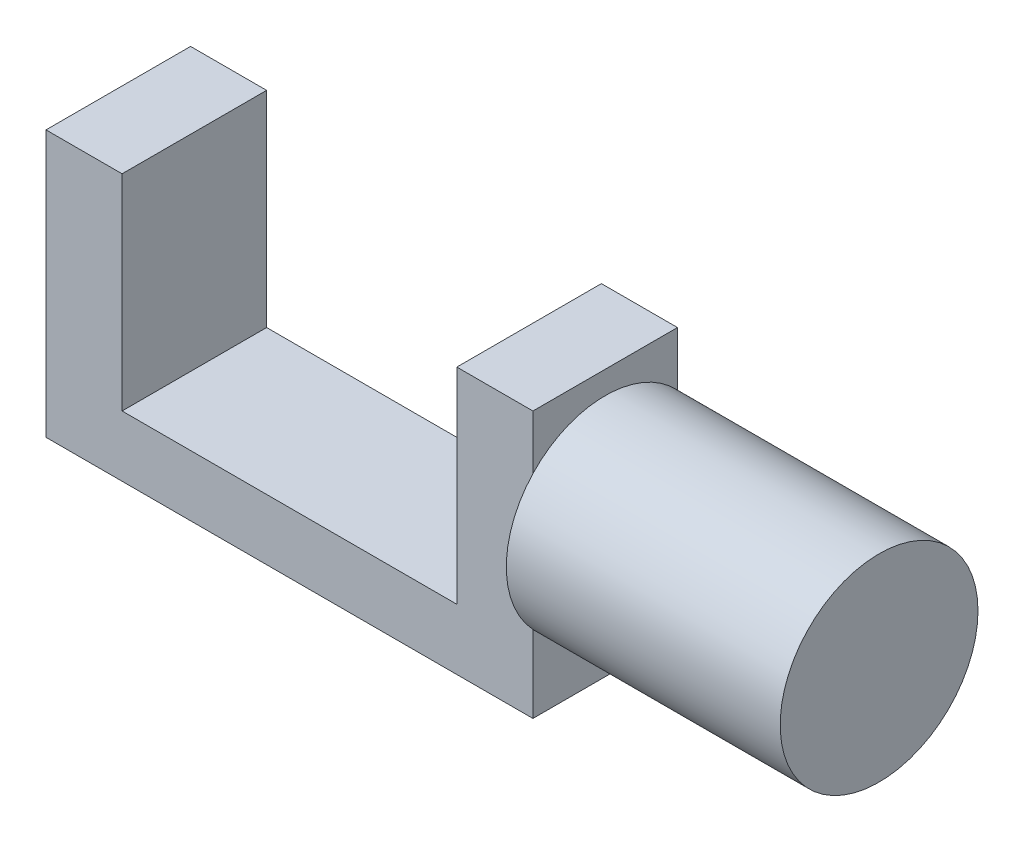
ISO-10303-21;
HEADER;
FILE_DESCRIPTION(('STEP AP214'),'2;1');
FILE_NAME('part.step','',(''),(''),'','','');
FILE_SCHEMA(('AUTOMOTIVE_DESIGN { 1 0 10303 214 1 1 1 1 }'));
ENDSEC;
DATA;
#1=APPLICATION_CONTEXT('core data for automotive mechanical design processes');
#2=APPLICATION_PROTOCOL_DEFINITION('international standard','automotive_design',2000,#1);
#3=PRODUCT_CONTEXT('',#1,'mechanical');
#4=PRODUCT('Part','Part','',(#3));
#5=PRODUCT_RELATED_PRODUCT_CATEGORY('part','',(#4));
#6=PRODUCT_DEFINITION_FORMATION('','',#4);
#7=PRODUCT_DEFINITION_CONTEXT('part definition',#1,'design');
#8=PRODUCT_DEFINITION('design','',#6,#7);
#9=PRODUCT_DEFINITION_SHAPE('','',#8);
#10=(LENGTH_UNIT() NAMED_UNIT(*) SI_UNIT(.MILLI.,.METRE.));
#11=(NAMED_UNIT(*) PLANE_ANGLE_UNIT() SI_UNIT($,.RADIAN.));
#12=(NAMED_UNIT(*) SI_UNIT($,.STERADIAN.) SOLID_ANGLE_UNIT());
#13=UNCERTAINTY_MEASURE_WITH_UNIT(LENGTH_MEASURE(1.E-05),#10,'distance_accuracy_value','');
#14=(GEOMETRIC_REPRESENTATION_CONTEXT(3) GLOBAL_UNCERTAINTY_ASSIGNED_CONTEXT((#13)) GLOBAL_UNIT_ASSIGNED_CONTEXT((#10,
#11,#12)) REPRESENTATION_CONTEXT('',''));
#15=CARTESIAN_POINT('',(0.,0.,0.));
#16=DIRECTION('',(0.,0.,1.));
#17=DIRECTION('',(1.,0.,0.));
#18=AXIS2_PLACEMENT_3D('',#15,#16,#17);
#19=CARTESIAN_POINT('',(32.,4.,0.));
#20=DIRECTION('',(-1.,0.,0.));
#21=DIRECTION('',(0.,0.,1.));
#22=AXIS2_PLACEMENT_3D('',#19,#20,#21);
#23=PLANE('',#22);
#24=CARTESIAN_POINT('',(32.,9.5,4.75));
#25=DIRECTION('',(1.,0.,0.));
#26=DIRECTION('',(0.,0.,-1.));
#27=AXIS2_PLACEMENT_3D('',#24,#25,#26);
#28=CIRCLE('',#27,6.5);
#29=CARTESIAN_POINT('',(32.,13.9370598373247,0.));
#30=VERTEX_POINT('',#29);
#31=CARTESIAN_POINT('',(32.,13.9370598373247,9.5));
#32=VERTEX_POINT('',#31);
#33=EDGE_CURVE('E45',#30,#32,#28,.T.);
#34=ORIENTED_EDGE('',*,*,#33,.F.);
#35=DIRECTION('',(0.,-1.,0.));
#36=VECTOR('',#35,1.);
#37=CARTESIAN_POINT('',(32.,4.,0.));
#38=LINE('',#37,#36);
#39=CARTESIAN_POINT('',(32.,17.5,0.));
#40=VERTEX_POINT('',#39);
#41=EDGE_CURVE('E119',#40,#30,#38,.T.);
#42=ORIENTED_EDGE('',*,*,#41,.F.);
#43=DIRECTION('',(0.,0.,-1.));
#44=VECTOR('',#43,1.);
#45=CARTESIAN_POINT('',(32.,17.5,0.));
#46=LINE('',#45,#44);
#47=CARTESIAN_POINT('',(32.,17.5,9.5));
#48=VERTEX_POINT('',#47);
#49=EDGE_CURVE('E140',#48,#40,#46,.T.);
#50=ORIENTED_EDGE('',*,*,#49,.F.);
#51=DIRECTION('',(0.,-1.,0.));
#52=VECTOR('',#51,1.);
#53=CARTESIAN_POINT('',(32.,4.,9.5));
#54=LINE('',#53,#52);
#55=EDGE_CURVE('E193',#48,#32,#54,.T.);
#56=ORIENTED_EDGE('',*,*,#55,.T.);
#57=EDGE_LOOP('',(#34,#42,#50,#56));
#58=FACE_BOUND('',#57,.T.);
#59=ADVANCED_FACE('F35',(#58),#23,.F.);
#60=CARTESIAN_POINT('',(0.,4.,0.));
#61=DIRECTION('',(0.,1.,0.));
#62=DIRECTION('',(0.,0.,1.));
#63=AXIS2_PLACEMENT_3D('',#60,#61,#62);
#64=PLANE('',#63);
#65=DIRECTION('',(1.,0.,0.));
#66=VECTOR('',#65,1.);
#67=CARTESIAN_POINT('',(0.,4.,9.5));
#68=LINE('',#67,#66);
#69=CARTESIAN_POINT('',(5.,4.,9.5));
#70=VERTEX_POINT('',#69);
#71=CARTESIAN_POINT('',(27.,4.,9.5));
#72=VERTEX_POINT('',#71);
#73=EDGE_CURVE('E179',#70,#72,#68,.T.);
#74=ORIENTED_EDGE('',*,*,#73,.T.);
#75=DIRECTION('',(0.,0.,1.));
#76=VECTOR('',#75,1.);
#77=CARTESIAN_POINT('',(27.,4.,0.));
#78=LINE('',#77,#76);
#79=CARTESIAN_POINT('',(27.,4.,0.));
#80=VERTEX_POINT('',#79);
#81=EDGE_CURVE('E144',#80,#72,#78,.T.);
#82=ORIENTED_EDGE('',*,*,#81,.F.);
#83=DIRECTION('',(-1.,0.,0.));
#84=VECTOR('',#83,1.);
#85=CARTESIAN_POINT('',(0.,4.,0.));
#86=LINE('',#85,#84);
#87=CARTESIAN_POINT('',(5.,4.,0.));
#88=VERTEX_POINT('',#87);
#89=EDGE_CURVE('E181',#80,#88,#86,.T.);
#90=ORIENTED_EDGE('',*,*,#89,.T.);
#91=DIRECTION('',(0.,0.,-1.));
#92=VECTOR('',#91,1.);
#93=CARTESIAN_POINT('',(5.,4.,0.));
#94=LINE('',#93,#92);
#95=EDGE_CURVE('E159',#70,#88,#94,.T.);
#96=ORIENTED_EDGE('',*,*,#95,.F.);
#97=EDGE_LOOP('',(#74,#82,#90,#96));
#98=FACE_BOUND('',#97,.T.);
#99=ADVANCED_FACE('F216',(#98),#64,.T.);
#100=CARTESIAN_POINT('',(0.,4.,0.));
#101=DIRECTION('',(1.,0.,0.));
#102=DIRECTION('',(0.,0.,-1.));
#103=AXIS2_PLACEMENT_3D('',#100,#101,#102);
#104=PLANE('',#103);
#105=DIRECTION('',(0.,0.,1.));
#106=VECTOR('',#105,1.);
#107=CARTESIAN_POINT('',(0.,0.,0.));
#108=LINE('',#107,#106);
#109=CARTESIAN_POINT('',(0.,0.,0.));
#110=VERTEX_POINT('',#109);
#111=CARTESIAN_POINT('',(0.,0.,9.5));
#112=VERTEX_POINT('',#111);
#113=EDGE_CURVE('E178',#110,#112,#108,.T.);
#114=ORIENTED_EDGE('',*,*,#113,.T.);
#115=DIRECTION('',(0.,-1.,0.));
#116=VECTOR('',#115,1.);
#117=CARTESIAN_POINT('',(0.,4.,9.5));
#118=LINE('',#117,#116);
#119=CARTESIAN_POINT('',(0.,17.5,9.5));
#120=VERTEX_POINT('',#119);
#121=EDGE_CURVE('E39',#120,#112,#118,.T.);
#122=ORIENTED_EDGE('',*,*,#121,.F.);
#123=DIRECTION('',(0.,0.,1.));
#124=VECTOR('',#123,1.);
#125=CARTESIAN_POINT('',(0.,17.5,0.));
#126=LINE('',#125,#124);
#127=CARTESIAN_POINT('',(0.,17.5,0.));
#128=VERTEX_POINT('',#127);
#129=EDGE_CURVE('E160',#128,#120,#126,.T.);
#130=ORIENTED_EDGE('',*,*,#129,.F.);
#131=DIRECTION('',(0.,-1.,0.));
#132=VECTOR('',#131,1.);
#133=CARTESIAN_POINT('',(0.,4.,0.));
#134=LINE('',#133,#132);
#135=EDGE_CURVE('E128',#128,#110,#134,.T.);
#136=ORIENTED_EDGE('',*,*,#135,.T.);
#137=EDGE_LOOP('',(#114,#122,#130,#136));
#138=FACE_BOUND('',#137,.T.);
#139=ADVANCED_FACE('F37',(#138),#104,.F.);
#140=CARTESIAN_POINT('',(0.,4.,9.5));
#141=DIRECTION('',(0.,0.,-1.));
#142=DIRECTION('',(-1.,0.,0.));
#143=AXIS2_PLACEMENT_3D('',#140,#141,#142);
#144=PLANE('',#143);
#145=DIRECTION('',(1.,0.,0.));
#146=VECTOR('',#145,1.);
#147=CARTESIAN_POINT('',(0.,0.,9.5));
#148=LINE('',#147,#146);
#149=CARTESIAN_POINT('',(32.,0.,9.5));
#150=VERTEX_POINT('',#149);
#151=EDGE_CURVE('E186',#112,#150,#148,.T.);
#152=ORIENTED_EDGE('',*,*,#151,.T.);
#153=CARTESIAN_POINT('',(32.,5.06294016267529,9.5));
#154=VERTEX_POINT('',#153);
#155=EDGE_CURVE('E192',#154,#150,#54,.T.);
#156=ORIENTED_EDGE('',*,*,#155,.F.);
#157=EDGE_CURVE('E58',#32,#154,#54,.T.);
#158=ORIENTED_EDGE('',*,*,#157,.F.);
#159=ORIENTED_EDGE('',*,*,#55,.F.);
#160=DIRECTION('',(1.,0.,0.));
#161=VECTOR('',#160,1.);
#162=CARTESIAN_POINT('',(32.,17.5,9.5));
#163=LINE('',#162,#161);
#164=CARTESIAN_POINT('',(27.,17.5,9.5));
#165=VERTEX_POINT('',#164);
#166=EDGE_CURVE('E148',#165,#48,#163,.T.);
#167=ORIENTED_EDGE('',*,*,#166,.F.);
#168=DIRECTION('',(0.,-1.,0.));
#169=VECTOR('',#168,1.);
#170=CARTESIAN_POINT('',(27.,17.5,9.5));
#171=LINE('',#170,#169);
#172=EDGE_CURVE('E151',#165,#72,#171,.T.);
#173=ORIENTED_EDGE('',*,*,#172,.T.);
#174=ORIENTED_EDGE('',*,*,#73,.F.);
#175=DIRECTION('',(0.,-1.,0.));
#176=VECTOR('',#175,1.);
#177=CARTESIAN_POINT('',(5.,17.5,9.5));
#178=LINE('',#177,#176);
#179=CARTESIAN_POINT('',(5.,17.5,9.5));
#180=VERTEX_POINT('',#179);
#181=EDGE_CURVE('E175',#180,#70,#178,.T.);
#182=ORIENTED_EDGE('',*,*,#181,.F.);
#183=DIRECTION('',(1.,0.,0.));
#184=VECTOR('',#183,1.);
#185=CARTESIAN_POINT('',(0.,17.5,9.5));
#186=LINE('',#185,#184);
#187=EDGE_CURVE('E163',#120,#180,#186,.T.);
#188=ORIENTED_EDGE('',*,*,#187,.F.);
#189=ORIENTED_EDGE('',*,*,#121,.T.);
#190=EDGE_LOOP('',(#152,#156,#158,#159,#167,#173,#174,#182,#188,#189));
#191=FACE_BOUND('',#190,.T.);
#192=ADVANCED_FACE('F197',(#191),#144,.F.);
#193=CARTESIAN_POINT('',(32.,5.06294016267529,0.));
#194=VERTEX_POINT('',#193);
#195=EDGE_CURVE('E11',#154,#194,#28,.T.);
#196=ORIENTED_EDGE('',*,*,#195,.F.);
#197=ORIENTED_EDGE('',*,*,#155,.T.);
#198=DIRECTION('',(0.,0.,-1.));
#199=VECTOR('',#198,1.);
#200=CARTESIAN_POINT('',(32.,0.,0.));
#201=LINE('',#200,#199);
#202=CARTESIAN_POINT('',(32.,0.,0.));
#203=VERTEX_POINT('',#202);
#204=EDGE_CURVE('E126',#150,#203,#201,.T.);
#205=ORIENTED_EDGE('',*,*,#204,.T.);
#206=EDGE_CURVE('E116',#194,#203,#38,.T.);
#207=ORIENTED_EDGE('',*,*,#206,.F.);
#208=EDGE_LOOP('',(#196,#197,#205,#207));
#209=FACE_BOUND('',#208,.T.);
#210=ADVANCED_FACE('F124',(#209),#23,.F.);
#211=CARTESIAN_POINT('',(0.,4.,0.));
#212=DIRECTION('',(0.,0.,1.));
#213=DIRECTION('',(1.,0.,0.));
#214=AXIS2_PLACEMENT_3D('',#211,#212,#213);
#215=PLANE('',#214);
#216=DIRECTION('',(-1.,0.,0.));
#217=VECTOR('',#216,1.);
#218=CARTESIAN_POINT('',(0.,0.,0.));
#219=LINE('',#218,#217);
#220=EDGE_CURVE('E182',#203,#110,#219,.T.);
#221=ORIENTED_EDGE('',*,*,#220,.T.);
#222=ORIENTED_EDGE('',*,*,#135,.F.);
#223=DIRECTION('',(-1.,0.,0.));
#224=VECTOR('',#223,1.);
#225=CARTESIAN_POINT('',(0.,17.5,0.));
#226=LINE('',#225,#224);
#227=CARTESIAN_POINT('',(5.,17.5,0.));
#228=VERTEX_POINT('',#227);
#229=EDGE_CURVE('E167',#228,#128,#226,.T.);
#230=ORIENTED_EDGE('',*,*,#229,.F.);
#231=DIRECTION('',(0.,-1.,0.));
#232=VECTOR('',#231,1.);
#233=CARTESIAN_POINT('',(5.,17.5,0.));
#234=LINE('',#233,#232);
#235=EDGE_CURVE('E170',#228,#88,#234,.T.);
#236=ORIENTED_EDGE('',*,*,#235,.T.);
#237=ORIENTED_EDGE('',*,*,#89,.F.);
#238=DIRECTION('',(0.,-1.,0.));
#239=VECTOR('',#238,1.);
#240=CARTESIAN_POINT('',(27.,17.5,0.));
#241=LINE('',#240,#239);
#242=CARTESIAN_POINT('',(27.,17.5,0.));
#243=VERTEX_POINT('',#242);
#244=EDGE_CURVE('E156',#243,#80,#241,.T.);
#245=ORIENTED_EDGE('',*,*,#244,.F.);
#246=DIRECTION('',(-1.,0.,0.));
#247=VECTOR('',#246,1.);
#248=CARTESIAN_POINT('',(32.,17.5,0.));
#249=LINE('',#248,#247);
#250=EDGE_CURVE('E143',#40,#243,#249,.T.);
#251=ORIENTED_EDGE('',*,*,#250,.F.);
#252=ORIENTED_EDGE('',*,*,#41,.T.);
#253=EDGE_CURVE('E114',#30,#194,#38,.T.);
#254=ORIENTED_EDGE('',*,*,#253,.T.);
#255=ORIENTED_EDGE('',*,*,#206,.T.);
#256=EDGE_LOOP('',(#221,#222,#230,#236,#237,#245,#251,#252,#254,#255));
#257=FACE_BOUND('',#256,.T.);
#258=ADVANCED_FACE('F115',(#257),#215,.F.);
#259=CARTESIAN_POINT('',(0.,0.,0.));
#260=DIRECTION('',(0.,1.,0.));
#261=DIRECTION('',(0.,0.,1.));
#262=AXIS2_PLACEMENT_3D('',#259,#260,#261);
#263=PLANE('',#262);
#264=ORIENTED_EDGE('',*,*,#113,.F.);
#265=ORIENTED_EDGE('',*,*,#220,.F.);
#266=ORIENTED_EDGE('',*,*,#204,.F.);
#267=ORIENTED_EDGE('',*,*,#151,.F.);
#268=EDGE_LOOP('',(#264,#265,#266,#267));
#269=FACE_BOUND('',#268,.T.);
#270=ADVANCED_FACE('F201',(#269),#263,.F.);
#271=CARTESIAN_POINT('',(5.,17.5,0.));
#272=DIRECTION('',(-1.,0.,0.));
#273=DIRECTION('',(0.,0.,1.));
#274=AXIS2_PLACEMENT_3D('',#271,#272,#273);
#275=PLANE('',#274);
#276=ORIENTED_EDGE('',*,*,#95,.T.);
#277=ORIENTED_EDGE('',*,*,#235,.F.);
#278=DIRECTION('',(0.,0.,-1.));
#279=VECTOR('',#278,1.);
#280=CARTESIAN_POINT('',(5.,17.5,0.));
#281=LINE('',#280,#279);
#282=EDGE_CURVE('E165',#180,#228,#281,.T.);
#283=ORIENTED_EDGE('',*,*,#282,.F.);
#284=ORIENTED_EDGE('',*,*,#181,.T.);
#285=EDGE_LOOP('',(#276,#277,#283,#284));
#286=FACE_BOUND('',#285,.T.);
#287=ADVANCED_FACE('F213',(#286),#275,.F.);
#288=CARTESIAN_POINT('',(0.,17.5,0.));
#289=DIRECTION('',(0.,1.,0.));
#290=DIRECTION('',(0.,0.,1.));
#291=AXIS2_PLACEMENT_3D('',#288,#289,#290);
#292=PLANE('',#291);
#293=ORIENTED_EDGE('',*,*,#129,.T.);
#294=ORIENTED_EDGE('',*,*,#187,.T.);
#295=ORIENTED_EDGE('',*,*,#282,.T.);
#296=ORIENTED_EDGE('',*,*,#229,.T.);
#297=EDGE_LOOP('',(#293,#294,#295,#296));
#298=FACE_BOUND('',#297,.T.);
#299=ADVANCED_FACE('F206',(#298),#292,.T.);
#300=CARTESIAN_POINT('',(27.,17.5,0.));
#301=DIRECTION('',(1.,0.,0.));
#302=DIRECTION('',(0.,0.,-1.));
#303=AXIS2_PLACEMENT_3D('',#300,#301,#302);
#304=PLANE('',#303);
#305=ORIENTED_EDGE('',*,*,#81,.T.);
#306=ORIENTED_EDGE('',*,*,#172,.F.);
#307=DIRECTION('',(0.,0.,1.));
#308=VECTOR('',#307,1.);
#309=CARTESIAN_POINT('',(27.,17.5,0.));
#310=LINE('',#309,#308);
#311=EDGE_CURVE('E146',#243,#165,#310,.T.);
#312=ORIENTED_EDGE('',*,*,#311,.F.);
#313=ORIENTED_EDGE('',*,*,#244,.T.);
#314=EDGE_LOOP('',(#305,#306,#312,#313));
#315=FACE_BOUND('',#314,.T.);
#316=ADVANCED_FACE('F221',(#315),#304,.F.);
#317=CARTESIAN_POINT('',(0.,17.5,0.));
#318=DIRECTION('',(0.,-1.,0.));
#319=DIRECTION('',(0.,0.,-1.));
#320=AXIS2_PLACEMENT_3D('',#317,#318,#319);
#321=PLANE('',#320);
#322=ORIENTED_EDGE('',*,*,#49,.T.);
#323=ORIENTED_EDGE('',*,*,#250,.T.);
#324=ORIENTED_EDGE('',*,*,#311,.T.);
#325=ORIENTED_EDGE('',*,*,#166,.T.);
#326=EDGE_LOOP('',(#322,#323,#324,#325));
#327=FACE_BOUND('',#326,.T.);
#328=ADVANCED_FACE('F223',(#327),#321,.F.);
#329=CARTESIAN_POINT('',(32.,9.5,4.75));
#330=DIRECTION('',(1.,0.,0.));
#331=DIRECTION('',(0.,0.,-1.));
#332=AXIS2_PLACEMENT_3D('',#329,#330,#331);
#333=PLANE('',#332);
#334=EDGE_CURVE('E46',#32,#154,#28,.T.);
#335=ORIENTED_EDGE('',*,*,#334,.F.);
#336=ORIENTED_EDGE('',*,*,#157,.T.);
#337=EDGE_LOOP('',(#335,#336));
#338=FACE_BOUND('',#337,.T.);
#339=ADVANCED_FACE('F292',(#338),#333,.F.);
#340=CARTESIAN_POINT('',(50.,9.5,4.75));
#341=DIRECTION('',(-1.,0.,0.));
#342=DIRECTION('',(0.,0.,1.));
#343=AXIS2_PLACEMENT_3D('',#340,#341,#342);
#344=CYLINDRICAL_SURFACE('',#343,6.5);
#345=CARTESIAN_POINT('',(50.,9.5,4.75));
#346=DIRECTION('',(1.,0.,0.));
#347=DIRECTION('',(0.,0.,-1.));
#348=AXIS2_PLACEMENT_3D('',#345,#346,#347);
#349=CIRCLE('',#348,6.5);
#350=CARTESIAN_POINT('',(50.,9.5,-1.75));
#351=VERTEX_POINT('',#350);
#352=EDGE_CURVE('E137',#351,#351,#349,.T.);
#353=ORIENTED_EDGE('',*,*,#352,.F.);
#354=EDGE_LOOP('',(#353));
#355=FACE_BOUND('',#354,.T.);
#356=ORIENTED_EDGE('',*,*,#33,.T.);
#357=ORIENTED_EDGE('',*,*,#334,.T.);
#358=ORIENTED_EDGE('',*,*,#195,.T.);
#359=EDGE_CURVE('E129',#194,#30,#28,.T.);
#360=ORIENTED_EDGE('',*,*,#359,.T.);
#361=EDGE_LOOP('',(#356,#357,#358,#360));
#362=FACE_BOUND('',#361,.T.);
#363=ADVANCED_FACE('F134',(#355,#362),#344,.T.);
#364=CARTESIAN_POINT('',(50.,9.5,4.75));
#365=DIRECTION('',(1.,0.,0.));
#366=DIRECTION('',(0.,0.,-1.));
#367=AXIS2_PLACEMENT_3D('',#364,#365,#366);
#368=PLANE('',#367);
#369=ORIENTED_EDGE('',*,*,#352,.T.);
#370=EDGE_LOOP('',(#369));
#371=FACE_BOUND('',#370,.T.);
#372=ADVANCED_FACE('F309',(#371),#368,.T.);
#373=ORIENTED_EDGE('',*,*,#253,.F.);
#374=ORIENTED_EDGE('',*,*,#359,.F.);
#375=EDGE_LOOP('',(#373,#374));
#376=FACE_BOUND('',#375,.T.);
#377=ADVANCED_FACE('F130',(#376),#333,.F.);
#378=CLOSED_SHELL('',(#59,#99,#139,#192,#210,#258,#270,#287,#299,#316,#328,#339,#363,#372,#377));
#379=MANIFOLD_SOLID_BREP('B2',#378);
#380=ADVANCED_BREP_SHAPE_REPRESENTATION('',(#18,#379),#14);
#381=SHAPE_DEFINITION_REPRESENTATION(#9,#380);
ENDSEC;
END-ISO-10303-21;
